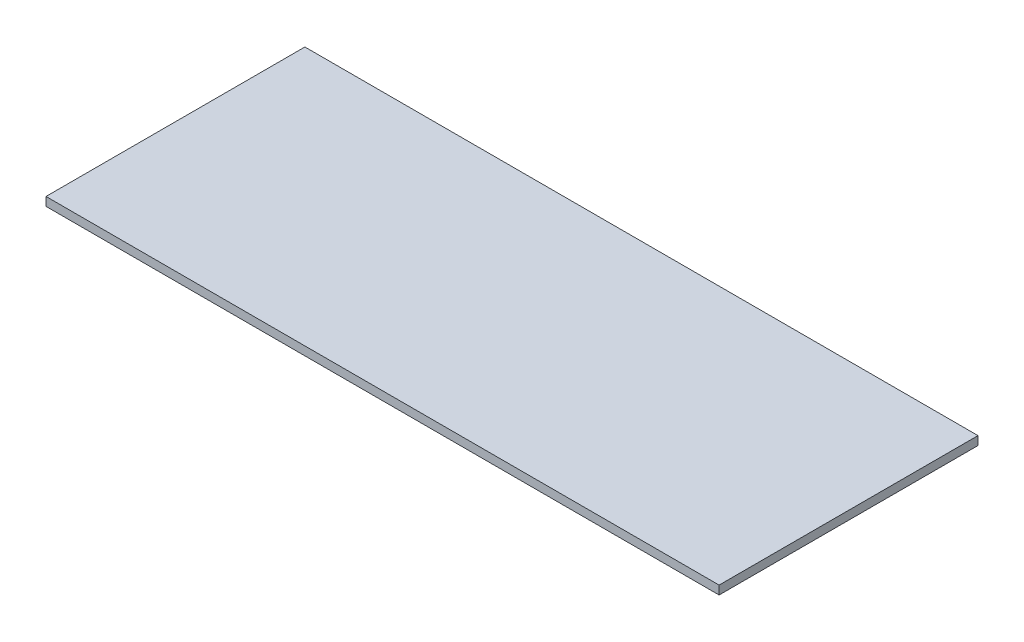
ISO-10303-21;
HEADER;
FILE_DESCRIPTION(('STEP AP214'),'2;1');
FILE_NAME('part.step','',(''),(''),'','','');
FILE_SCHEMA(('AUTOMOTIVE_DESIGN { 1 0 10303 214 1 1 1 1 }'));
ENDSEC;
DATA;
#1=APPLICATION_CONTEXT('core data for automotive mechanical design processes');
#2=APPLICATION_PROTOCOL_DEFINITION('international standard','automotive_design',2000,#1);
#3=PRODUCT_CONTEXT('',#1,'mechanical');
#4=PRODUCT('Part','Part','',(#3));
#5=PRODUCT_RELATED_PRODUCT_CATEGORY('part','',(#4));
#6=PRODUCT_DEFINITION_FORMATION('','',#4);
#7=PRODUCT_DEFINITION_CONTEXT('part definition',#1,'design');
#8=PRODUCT_DEFINITION('design','',#6,#7);
#9=PRODUCT_DEFINITION_SHAPE('','',#8);
#10=(LENGTH_UNIT() NAMED_UNIT(*) SI_UNIT(.MILLI.,.METRE.));
#11=(NAMED_UNIT(*) PLANE_ANGLE_UNIT() SI_UNIT($,.RADIAN.));
#12=(NAMED_UNIT(*) SI_UNIT($,.STERADIAN.) SOLID_ANGLE_UNIT());
#13=UNCERTAINTY_MEASURE_WITH_UNIT(LENGTH_MEASURE(1.E-05),#10,'distance_accuracy_value','');
#14=(GEOMETRIC_REPRESENTATION_CONTEXT(3) GLOBAL_UNCERTAINTY_ASSIGNED_CONTEXT((#13)) GLOBAL_UNIT_ASSIGNED_CONTEXT((#10,
#11,#12)) REPRESENTATION_CONTEXT('',''));
#15=CARTESIAN_POINT('',(0.,0.,0.));
#16=DIRECTION('',(0.,0.,1.));
#17=DIRECTION('',(1.,0.,0.));
#18=AXIS2_PLACEMENT_3D('',#15,#16,#17);
#19=CARTESIAN_POINT('',(990.6,25.4,381.));
#20=DIRECTION('',(-1.,0.,0.));
#21=DIRECTION('',(0.,0.,1.));
#22=AXIS2_PLACEMENT_3D('',#19,#20,#21);
#23=PLANE('',#22);
#24=DIRECTION('',(0.,0.,-1.));
#25=VECTOR('',#24,1.);
#26=CARTESIAN_POINT('',(990.6,0.,381.));
#27=LINE('',#26,#25);
#28=CARTESIAN_POINT('',(990.6,0.,381.));
#29=VERTEX_POINT('',#28);
#30=CARTESIAN_POINT('',(990.6,0.,-381.));
#31=VERTEX_POINT('',#30);
#32=EDGE_CURVE('E99',#29,#31,#27,.T.);
#33=ORIENTED_EDGE('',*,*,#32,.T.);
#34=DIRECTION('',(0.,-1.,0.));
#35=VECTOR('',#34,1.);
#36=CARTESIAN_POINT('',(990.6,25.4,-381.));
#37=LINE('',#36,#35);
#38=CARTESIAN_POINT('',(990.6,25.4,-381.));
#39=VERTEX_POINT('',#38);
#40=EDGE_CURVE('E11',#39,#31,#37,.T.);
#41=ORIENTED_EDGE('',*,*,#40,.F.);
#42=DIRECTION('',(0.,0.,-1.));
#43=VECTOR('',#42,1.);
#44=CARTESIAN_POINT('',(990.6,25.4,381.));
#45=LINE('',#44,#43);
#46=CARTESIAN_POINT('',(990.6,25.4,381.));
#47=VERTEX_POINT('',#46);
#48=EDGE_CURVE('E87',#47,#39,#45,.T.);
#49=ORIENTED_EDGE('',*,*,#48,.F.);
#50=DIRECTION('',(0.,-1.,0.));
#51=VECTOR('',#50,1.);
#52=CARTESIAN_POINT('',(990.6,25.4,381.));
#53=LINE('',#52,#51);
#54=EDGE_CURVE('E95',#47,#29,#53,.T.);
#55=ORIENTED_EDGE('',*,*,#54,.T.);
#56=EDGE_LOOP('',(#33,#41,#49,#55));
#57=FACE_BOUND('',#56,.T.);
#58=ADVANCED_FACE('F36',(#57),#23,.F.);
#59=CARTESIAN_POINT('',(-990.6,25.4,-381.));
#60=DIRECTION('',(0.,0.,1.));
#61=DIRECTION('',(1.,0.,0.));
#62=AXIS2_PLACEMENT_3D('',#59,#60,#61);
#63=PLANE('',#62);
#64=DIRECTION('',(-1.,0.,0.));
#65=VECTOR('',#64,1.);
#66=CARTESIAN_POINT('',(-990.6,0.,-381.));
#67=LINE('',#66,#65);
#68=CARTESIAN_POINT('',(-990.6,0.,-381.));
#69=VERTEX_POINT('',#68);
#70=EDGE_CURVE('E91',#31,#69,#67,.T.);
#71=ORIENTED_EDGE('',*,*,#70,.T.);
#72=DIRECTION('',(0.,-1.,0.));
#73=VECTOR('',#72,1.);
#74=CARTESIAN_POINT('',(-990.6,25.4,-381.));
#75=LINE('',#74,#73);
#76=CARTESIAN_POINT('',(-990.6,25.4,-381.));
#77=VERTEX_POINT('',#76);
#78=EDGE_CURVE('E44',#77,#69,#75,.T.);
#79=ORIENTED_EDGE('',*,*,#78,.F.);
#80=DIRECTION('',(-1.,0.,0.));
#81=VECTOR('',#80,1.);
#82=CARTESIAN_POINT('',(-990.6,25.4,-381.));
#83=LINE('',#82,#81);
#84=EDGE_CURVE('E82',#39,#77,#83,.T.);
#85=ORIENTED_EDGE('',*,*,#84,.F.);
#86=ORIENTED_EDGE('',*,*,#40,.T.);
#87=EDGE_LOOP('',(#71,#79,#85,#86));
#88=FACE_BOUND('',#87,.T.);
#89=ADVANCED_FACE('F90',(#88),#63,.F.);
#90=CARTESIAN_POINT('',(-990.6,25.4,381.));
#91=DIRECTION('',(1.,0.,0.));
#92=DIRECTION('',(0.,0.,-1.));
#93=AXIS2_PLACEMENT_3D('',#90,#91,#92);
#94=PLANE('',#93);
#95=DIRECTION('',(0.,0.,1.));
#96=VECTOR('',#95,1.);
#97=CARTESIAN_POINT('',(-990.6,0.,381.));
#98=LINE('',#97,#96);
#99=CARTESIAN_POINT('',(-990.6,0.,381.));
#100=VERTEX_POINT('',#99);
#101=EDGE_CURVE('E69',#69,#100,#98,.T.);
#102=ORIENTED_EDGE('',*,*,#101,.T.);
#103=DIRECTION('',(0.,-1.,0.));
#104=VECTOR('',#103,1.);
#105=CARTESIAN_POINT('',(-990.6,25.4,381.));
#106=LINE('',#105,#104);
#107=CARTESIAN_POINT('',(-990.6,25.4,381.));
#108=VERTEX_POINT('',#107);
#109=EDGE_CURVE('E92',#108,#100,#106,.T.);
#110=ORIENTED_EDGE('',*,*,#109,.F.);
#111=DIRECTION('',(0.,0.,1.));
#112=VECTOR('',#111,1.);
#113=CARTESIAN_POINT('',(-990.6,25.4,381.));
#114=LINE('',#113,#112);
#115=EDGE_CURVE('E85',#77,#108,#114,.T.);
#116=ORIENTED_EDGE('',*,*,#115,.F.);
#117=ORIENTED_EDGE('',*,*,#78,.T.);
#118=EDGE_LOOP('',(#102,#110,#116,#117));
#119=FACE_BOUND('',#118,.T.);
#120=ADVANCED_FACE('F93',(#119),#94,.F.);
#121=CARTESIAN_POINT('',(-990.6,25.4,381.));
#122=DIRECTION('',(0.,0.,-1.));
#123=DIRECTION('',(-1.,0.,0.));
#124=AXIS2_PLACEMENT_3D('',#121,#122,#123);
#125=PLANE('',#124);
#126=DIRECTION('',(1.,0.,0.));
#127=VECTOR('',#126,1.);
#128=CARTESIAN_POINT('',(-990.6,0.,381.));
#129=LINE('',#128,#127);
#130=EDGE_CURVE('E75',#100,#29,#129,.T.);
#131=ORIENTED_EDGE('',*,*,#130,.T.);
#132=ORIENTED_EDGE('',*,*,#54,.F.);
#133=DIRECTION('',(1.,0.,0.));
#134=VECTOR('',#133,1.);
#135=CARTESIAN_POINT('',(-990.6,25.4,381.));
#136=LINE('',#135,#134);
#137=EDGE_CURVE('E52',#108,#47,#136,.T.);
#138=ORIENTED_EDGE('',*,*,#137,.F.);
#139=ORIENTED_EDGE('',*,*,#109,.T.);
#140=EDGE_LOOP('',(#131,#132,#138,#139));
#141=FACE_BOUND('',#140,.T.);
#142=ADVANCED_FACE('F106',(#141),#125,.F.);
#143=CARTESIAN_POINT('',(0.,25.4,0.));
#144=DIRECTION('',(0.,-1.,0.));
#145=DIRECTION('',(0.,0.,-1.));
#146=AXIS2_PLACEMENT_3D('',#143,#144,#145);
#147=PLANE('',#146);
#148=ORIENTED_EDGE('',*,*,#48,.T.);
#149=ORIENTED_EDGE('',*,*,#84,.T.);
#150=ORIENTED_EDGE('',*,*,#115,.T.);
#151=ORIENTED_EDGE('',*,*,#137,.T.);
#152=EDGE_LOOP('',(#148,#149,#150,#151));
#153=FACE_BOUND('',#152,.T.);
#154=ADVANCED_FACE('F83',(#153),#147,.F.);
#155=CARTESIAN_POINT('',(0.,0.,0.));
#156=DIRECTION('',(0.,-1.,0.));
#157=DIRECTION('',(0.,0.,-1.));
#158=AXIS2_PLACEMENT_3D('',#155,#156,#157);
#159=PLANE('',#158);
#160=ORIENTED_EDGE('',*,*,#32,.F.);
#161=ORIENTED_EDGE('',*,*,#130,.F.);
#162=ORIENTED_EDGE('',*,*,#101,.F.);
#163=ORIENTED_EDGE('',*,*,#70,.F.);
#164=EDGE_LOOP('',(#160,#161,#162,#163));
#165=FACE_BOUND('',#164,.T.);
#166=ADVANCED_FACE('F109',(#165),#159,.T.);
#167=CLOSED_SHELL('',(#58,#89,#120,#142,#154,#166));
#168=MANIFOLD_SOLID_BREP('B2',#167);
#169=ADVANCED_BREP_SHAPE_REPRESENTATION('',(#18,#168),#14);
#170=SHAPE_DEFINITION_REPRESENTATION(#9,#169);
ENDSEC;
END-ISO-10303-21;
